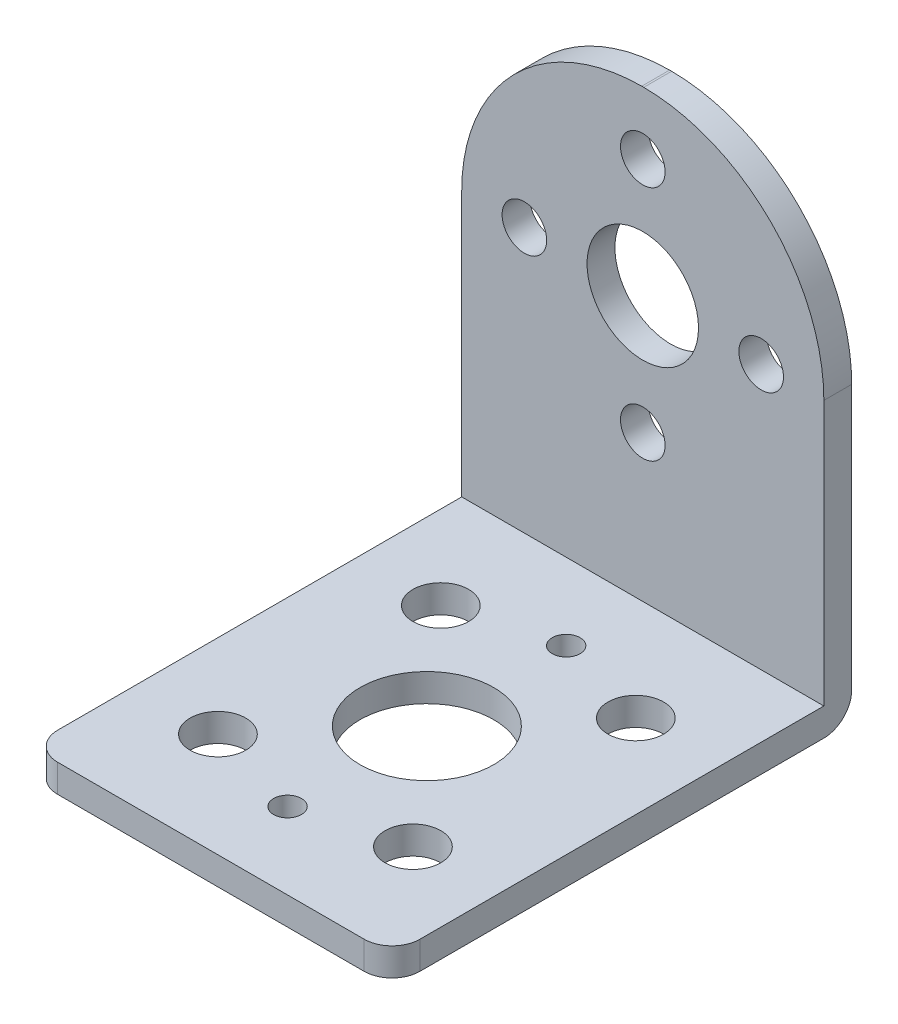
ISO-10303-21;
HEADER;
FILE_DESCRIPTION(('STEP AP214'),'2;1');
FILE_NAME('part.step','',(''),(''),'','','');
FILE_SCHEMA(('AUTOMOTIVE_DESIGN { 1 0 10303 214 1 1 1 1 }'));
ENDSEC;
DATA;
#1=APPLICATION_CONTEXT('core data for automotive mechanical design processes');
#2=APPLICATION_PROTOCOL_DEFINITION('international standard','automotive_design',2000,#1);
#3=PRODUCT_CONTEXT('',#1,'mechanical');
#4=PRODUCT('Part','Part','',(#3));
#5=PRODUCT_RELATED_PRODUCT_CATEGORY('part','',(#4));
#6=PRODUCT_DEFINITION_FORMATION('','',#4);
#7=PRODUCT_DEFINITION_CONTEXT('part definition',#1,'design');
#8=PRODUCT_DEFINITION('design','',#6,#7);
#9=PRODUCT_DEFINITION_SHAPE('','',#8);
#10=(LENGTH_UNIT() NAMED_UNIT(*) SI_UNIT(.MILLI.,.METRE.));
#11=(NAMED_UNIT(*) PLANE_ANGLE_UNIT() SI_UNIT($,.RADIAN.));
#12=(NAMED_UNIT(*) SI_UNIT($,.STERADIAN.) SOLID_ANGLE_UNIT());
#13=UNCERTAINTY_MEASURE_WITH_UNIT(LENGTH_MEASURE(1.E-05),#10,'distance_accuracy_value','');
#14=(GEOMETRIC_REPRESENTATION_CONTEXT(3) GLOBAL_UNCERTAINTY_ASSIGNED_CONTEXT((#13)) GLOBAL_UNIT_ASSIGNED_CONTEXT((#10,
#11,#12)) REPRESENTATION_CONTEXT('',''));
#15=CARTESIAN_POINT('',(0.,0.,0.));
#16=DIRECTION('',(0.,0.,1.));
#17=DIRECTION('',(1.,0.,0.));
#18=AXIS2_PLACEMENT_3D('',#15,#16,#17);
#19=CARTESIAN_POINT('',(13.,2.,0.));
#20=DIRECTION('',(-1.,0.,0.));
#21=DIRECTION('',(0.,0.,1.));
#22=AXIS2_PLACEMENT_3D('',#19,#20,#21);
#23=PLANE('',#22);
#24=DIRECTION('',(0.,0.,-1.));
#25=VECTOR('',#24,1.);
#26=CARTESIAN_POINT('',(13.,2.,0.));
#27=LINE('',#26,#25);
#28=CARTESIAN_POINT('',(13.,2.,13.5));
#29=VERTEX_POINT('',#28);
#30=CARTESIAN_POINT('',(13.,2.,-15.5));
#31=VERTEX_POINT('',#30);
#32=EDGE_CURVE('E243',#29,#31,#27,.T.);
#33=ORIENTED_EDGE('',*,*,#32,.F.);
#34=DIRECTION('',(0.,-1.,0.));
#35=VECTOR('',#34,1.);
#36=CARTESIAN_POINT('',(13.,2.,13.5));
#37=LINE('',#36,#35);
#38=CARTESIAN_POINT('',(13.,0.,13.5));
#39=VERTEX_POINT('',#38);
#40=EDGE_CURVE('E11',#29,#39,#37,.T.);
#41=ORIENTED_EDGE('',*,*,#40,.T.);
#42=DIRECTION('',(0.,0.,-1.));
#43=VECTOR('',#42,1.);
#44=CARTESIAN_POINT('',(13.,0.,0.));
#45=LINE('',#44,#43);
#46=CARTESIAN_POINT('',(13.,0.,-15.5));
#47=VERTEX_POINT('',#46);
#48=EDGE_CURVE('E274',#39,#47,#45,.T.);
#49=ORIENTED_EDGE('',*,*,#48,.T.);
#50=CARTESIAN_POINT('',(13.,2.,-15.5));
#51=DIRECTION('',(-1.,0.,0.));
#52=DIRECTION('',(0.,0.,1.));
#53=AXIS2_PLACEMENT_3D('',#50,#51,#52);
#54=CIRCLE('',#53,2.);
#55=CARTESIAN_POINT('',(13.,2.,-17.5));
#56=VERTEX_POINT('',#55);
#57=EDGE_CURVE('E288',#47,#56,#54,.F.);
#58=ORIENTED_EDGE('',*,*,#57,.T.);
#59=DIRECTION('',(0.,-1.,0.));
#60=VECTOR('',#59,1.);
#61=CARTESIAN_POINT('',(13.,34.,-17.5));
#62=LINE('',#61,#60);
#63=CARTESIAN_POINT('',(13.,21.,-17.5));
#64=VERTEX_POINT('',#63);
#65=EDGE_CURVE('E215',#64,#56,#62,.T.);
#66=ORIENTED_EDGE('',*,*,#65,.F.);
#67=DIRECTION('',(0.,0.,1.));
#68=VECTOR('',#67,1.);
#69=CARTESIAN_POINT('',(13.,21.,-49.5));
#70=LINE('',#69,#68);
#71=CARTESIAN_POINT('',(13.,21.,-15.5));
#72=VERTEX_POINT('',#71);
#73=EDGE_CURVE('E151',#64,#72,#70,.T.);
#74=ORIENTED_EDGE('',*,*,#73,.T.);
#75=DIRECTION('',(0.,-1.,0.));
#76=VECTOR('',#75,1.);
#77=CARTESIAN_POINT('',(13.,34.,-15.5));
#78=LINE('',#77,#76);
#79=EDGE_CURVE('E168',#72,#31,#78,.T.);
#80=ORIENTED_EDGE('',*,*,#79,.T.);
#81=EDGE_LOOP('',(#33,#41,#49,#58,#66,#74,#80));
#82=FACE_BOUND('',#81,.T.);
#83=ADVANCED_FACE('F44',(#82),#23,.F.);
#84=CARTESIAN_POINT('',(13.,34.,-17.5));
#85=DIRECTION('',(0.,0.,1.));
#86=DIRECTION('',(1.,0.,0.));
#87=AXIS2_PLACEMENT_3D('',#84,#85,#86);
#88=PLANE('',#87);
#89=CARTESIAN_POINT('',(8.49999999999999,21.,-17.5));
#90=DIRECTION('',(0.,0.,1.));
#91=DIRECTION('',(1.,0.,0.));
#92=AXIS2_PLACEMENT_3D('',#89,#90,#91);
#93=CIRCLE('',#92,1.6);
#94=CARTESIAN_POINT('',(10.1,21.,-17.5));
#95=VERTEX_POINT('',#94);
#96=EDGE_CURVE('E198',#95,#95,#93,.T.);
#97=ORIENTED_EDGE('',*,*,#96,.T.);
#98=EDGE_LOOP('',(#97));
#99=FACE_BOUND('',#98,.T.);
#100=CARTESIAN_POINT('',(-8.5,21.,-17.5));
#101=DIRECTION('',(0.,0.,1.));
#102=DIRECTION('',(1.,0.,0.));
#103=AXIS2_PLACEMENT_3D('',#100,#101,#102);
#104=CIRCLE('',#103,1.6);
#105=CARTESIAN_POINT('',(-6.9,21.,-17.5));
#106=VERTEX_POINT('',#105);
#107=EDGE_CURVE('E191',#106,#106,#104,.T.);
#108=ORIENTED_EDGE('',*,*,#107,.T.);
#109=EDGE_LOOP('',(#108));
#110=FACE_BOUND('',#109,.T.);
#111=CARTESIAN_POINT('',(0.,21.,-17.5));
#112=DIRECTION('',(0.,0.,1.));
#113=DIRECTION('',(1.,0.,0.));
#114=AXIS2_PLACEMENT_3D('',#111,#112,#113);
#115=CIRCLE('',#114,4.);
#116=CARTESIAN_POINT('',(4.,21.,-17.5));
#117=VERTEX_POINT('',#116);
#118=EDGE_CURVE('E188',#117,#117,#115,.T.);
#119=ORIENTED_EDGE('',*,*,#118,.T.);
#120=EDGE_LOOP('',(#119));
#121=FACE_BOUND('',#120,.T.);
#122=CARTESIAN_POINT('',(0.,29.5,-17.5));
#123=DIRECTION('',(0.,0.,1.));
#124=DIRECTION('',(1.,0.,0.));
#125=AXIS2_PLACEMENT_3D('',#122,#123,#124);
#126=CIRCLE('',#125,1.6);
#127=CARTESIAN_POINT('',(1.6,29.5,-17.5));
#128=VERTEX_POINT('',#127);
#129=EDGE_CURVE('E194',#128,#128,#126,.T.);
#130=ORIENTED_EDGE('',*,*,#129,.T.);
#131=EDGE_LOOP('',(#130));
#132=FACE_BOUND('',#131,.T.);
#133=ORIENTED_EDGE('',*,*,#65,.T.);
#134=DIRECTION('',(-1.,0.,0.));
#135=VECTOR('',#134,1.);
#136=CARTESIAN_POINT('',(13.,2.,-17.5));
#137=LINE('',#136,#135);
#138=CARTESIAN_POINT('',(-13.,2.,-17.5));
#139=VERTEX_POINT('',#138);
#140=EDGE_CURVE('E280',#56,#139,#137,.T.);
#141=ORIENTED_EDGE('',*,*,#140,.T.);
#142=DIRECTION('',(0.,-1.,0.));
#143=VECTOR('',#142,1.);
#144=CARTESIAN_POINT('',(-13.,34.,-17.5));
#145=LINE('',#144,#143);
#146=CARTESIAN_POINT('',(-13.,21.0000000000007,-17.5));
#147=VERTEX_POINT('',#146);
#148=EDGE_CURVE('E212',#147,#139,#145,.T.);
#149=ORIENTED_EDGE('',*,*,#148,.F.);
#150=CARTESIAN_POINT('',(0.,21.,-17.5));
#151=DIRECTION('',(0.,0.,1.));
#152=DIRECTION('',(1.,0.,0.));
#153=AXIS2_PLACEMENT_3D('',#150,#151,#152);
#154=CIRCLE('',#153,13.);
#155=CARTESIAN_POINT('',(-0.0721104708132433,33.9998000015384,-17.5));
#156=VERTEX_POINT('',#155);
#157=EDGE_CURVE('E185',#147,#156,#154,.F.);
#158=ORIENTED_EDGE('',*,*,#157,.T.);
#159=CARTESIAN_POINT('',(-0.0721110255091726,33.9999,-17.5));
#160=DIRECTION('',(0.,0.,1.));
#161=DIRECTION('',(1.,0.,0.));
#162=AXIS2_PLACEMENT_3D('',#159,#160,#161);
#163=CIRCLE('',#162,0.000100000000002766);
#164=CARTESIAN_POINT('',(-0.0721110255091726,34.,-17.5));
#165=VERTEX_POINT('',#164);
#166=EDGE_CURVE('E179',#156,#165,#163,.T.);
#167=ORIENTED_EDGE('',*,*,#166,.T.);
#168=DIRECTION('',(-1.,0.,0.));
#169=VECTOR('',#168,1.);
#170=CARTESIAN_POINT('',(13.,34.,-17.5));
#171=LINE('',#170,#169);
#172=CARTESIAN_POINT('',(0.0721110255093565,34.,-17.5));
#173=VERTEX_POINT('',#172);
#174=EDGE_CURVE('E204',#173,#165,#171,.T.);
#175=ORIENTED_EDGE('',*,*,#174,.F.);
#176=CARTESIAN_POINT('',(0.0721110255093571,33.9999,-17.5));
#177=DIRECTION('',(0.,0.,1.));
#178=DIRECTION('',(1.,0.,0.));
#179=AXIS2_PLACEMENT_3D('',#176,#177,#178);
#180=CIRCLE('',#179,9.99999999923578E-05);
#181=CARTESIAN_POINT('',(0.0721104708134278,33.9998000015385,-17.5));
#182=VERTEX_POINT('',#181);
#183=EDGE_CURVE('E183',#173,#182,#180,.T.);
#184=ORIENTED_EDGE('',*,*,#183,.T.);
#185=CARTESIAN_POINT('',(0.,21.,-17.5));
#186=DIRECTION('',(0.,0.,1.));
#187=DIRECTION('',(1.,0.,0.));
#188=AXIS2_PLACEMENT_3D('',#185,#186,#187);
#189=CIRCLE('',#188,13.);
#190=EDGE_CURVE('E148',#182,#64,#189,.F.);
#191=ORIENTED_EDGE('',*,*,#190,.T.);
#192=EDGE_LOOP('',(#133,#141,#149,#158,#167,#175,#184,#191));
#193=FACE_BOUND('',#192,.T.);
#194=CARTESIAN_POINT('',(0.,12.5,-17.5));
#195=DIRECTION('',(0.,0.,1.));
#196=DIRECTION('',(1.,0.,0.));
#197=AXIS2_PLACEMENT_3D('',#194,#195,#196);
#198=CIRCLE('',#197,1.6);
#199=CARTESIAN_POINT('',(1.6,12.5,-17.5));
#200=VERTEX_POINT('',#199);
#201=EDGE_CURVE('E201',#200,#200,#198,.T.);
#202=ORIENTED_EDGE('',*,*,#201,.T.);
#203=EDGE_LOOP('',(#202));
#204=FACE_BOUND('',#203,.T.);
#205=ADVANCED_FACE('F322',(#99,#110,#121,#132,#193,#204),#88,.F.);
#206=CARTESIAN_POINT('',(-13.,34.,-15.5));
#207=DIRECTION('',(0.,0.,-1.));
#208=DIRECTION('',(-1.,0.,0.));
#209=AXIS2_PLACEMENT_3D('',#206,#207,#208);
#210=PLANE('',#209);
#211=CARTESIAN_POINT('',(8.49999999999999,21.,-15.5));
#212=DIRECTION('',(0.,0.,1.));
#213=DIRECTION('',(1.,0.,0.));
#214=AXIS2_PLACEMENT_3D('',#211,#212,#213);
#215=CIRCLE('',#214,1.6);
#216=CARTESIAN_POINT('',(10.1,21.,-15.5));
#217=VERTEX_POINT('',#216);
#218=EDGE_CURVE('E626',#217,#217,#215,.T.);
#219=ORIENTED_EDGE('',*,*,#218,.F.);
#220=EDGE_LOOP('',(#219));
#221=FACE_BOUND('',#220,.T.);
#222=CARTESIAN_POINT('',(-8.5,21.,-15.5));
#223=DIRECTION('',(0.,0.,1.));
#224=DIRECTION('',(1.,0.,0.));
#225=AXIS2_PLACEMENT_3D('',#222,#223,#224);
#226=CIRCLE('',#225,1.6);
#227=CARTESIAN_POINT('',(-6.9,21.,-15.5));
#228=VERTEX_POINT('',#227);
#229=EDGE_CURVE('E620',#228,#228,#226,.T.);
#230=ORIENTED_EDGE('',*,*,#229,.F.);
#231=EDGE_LOOP('',(#230));
#232=FACE_BOUND('',#231,.T.);
#233=CARTESIAN_POINT('',(0.,21.,-15.5));
#234=DIRECTION('',(0.,0.,1.));
#235=DIRECTION('',(1.,0.,0.));
#236=AXIS2_PLACEMENT_3D('',#233,#234,#235);
#237=CIRCLE('',#236,4.);
#238=CARTESIAN_POINT('',(4.,21.,-15.5));
#239=VERTEX_POINT('',#238);
#240=EDGE_CURVE('E613',#239,#239,#237,.T.);
#241=ORIENTED_EDGE('',*,*,#240,.F.);
#242=EDGE_LOOP('',(#241));
#243=FACE_BOUND('',#242,.T.);
#244=CARTESIAN_POINT('',(0.,29.5,-15.5));
#245=DIRECTION('',(0.,0.,1.));
#246=DIRECTION('',(1.,0.,0.));
#247=AXIS2_PLACEMENT_3D('',#244,#245,#246);
#248=CIRCLE('',#247,1.6);
#249=CARTESIAN_POINT('',(1.6,29.5,-15.5));
#250=VERTEX_POINT('',#249);
#251=EDGE_CURVE('E152',#250,#250,#248,.T.);
#252=ORIENTED_EDGE('',*,*,#251,.F.);
#253=EDGE_LOOP('',(#252));
#254=FACE_BOUND('',#253,.T.);
#255=ORIENTED_EDGE('',*,*,#79,.F.);
#256=CARTESIAN_POINT('',(0.,21.,-15.5));
#257=DIRECTION('',(0.,0.,-1.));
#258=DIRECTION('',(1.,0.,0.));
#259=AXIS2_PLACEMENT_3D('',#256,#257,#258);
#260=CIRCLE('',#259,13.);
#261=CARTESIAN_POINT('',(0.0721104708134278,33.9998000015385,-15.5));
#262=VERTEX_POINT('',#261);
#263=EDGE_CURVE('E145',#262,#72,#260,.T.);
#264=ORIENTED_EDGE('',*,*,#263,.F.);
#265=CARTESIAN_POINT('',(0.0721110255093571,33.9999,-15.5));
#266=DIRECTION('',(0.,0.,1.));
#267=DIRECTION('',(1.,0.,0.));
#268=AXIS2_PLACEMENT_3D('',#265,#266,#267);
#269=CIRCLE('',#268,9.99999999923578E-05);
#270=CARTESIAN_POINT('',(0.0721110255093571,34.,-15.5));
#271=VERTEX_POINT('',#270);
#272=EDGE_CURVE('E155',#271,#262,#269,.T.);
#273=ORIENTED_EDGE('',*,*,#272,.F.);
#274=DIRECTION('',(1.,0.,0.));
#275=VECTOR('',#274,1.);
#276=CARTESIAN_POINT('',(-13.,34.,-15.5));
#277=LINE('',#276,#275);
#278=CARTESIAN_POINT('',(-0.0721110255091726,34.,-15.5));
#279=VERTEX_POINT('',#278);
#280=EDGE_CURVE('E207',#279,#271,#277,.T.);
#281=ORIENTED_EDGE('',*,*,#280,.F.);
#282=CARTESIAN_POINT('',(-0.0721110255091726,33.9999,-15.5));
#283=DIRECTION('',(0.,0.,1.));
#284=DIRECTION('',(-1.,0.,0.));
#285=AXIS2_PLACEMENT_3D('',#282,#283,#284);
#286=CIRCLE('',#285,0.000100000000002766);
#287=CARTESIAN_POINT('',(-0.0721104708132433,33.9998000015384,-15.5));
#288=VERTEX_POINT('',#287);
#289=EDGE_CURVE('E172',#288,#279,#286,.T.);
#290=ORIENTED_EDGE('',*,*,#289,.F.);
#291=CARTESIAN_POINT('',(0.,21.,-15.5));
#292=DIRECTION('',(0.,0.,-1.));
#293=DIRECTION('',(1.,0.,0.));
#294=AXIS2_PLACEMENT_3D('',#291,#292,#293);
#295=CIRCLE('',#294,13.);
#296=CARTESIAN_POINT('',(-13.,21.0000000000007,-15.5));
#297=VERTEX_POINT('',#296);
#298=EDGE_CURVE('E169',#297,#288,#295,.T.);
#299=ORIENTED_EDGE('',*,*,#298,.F.);
#300=DIRECTION('',(0.,-1.,0.));
#301=VECTOR('',#300,1.);
#302=CARTESIAN_POINT('',(-13.,34.,-15.5));
#303=LINE('',#302,#301);
#304=CARTESIAN_POINT('',(-13.,2.,-15.5));
#305=VERTEX_POINT('',#304);
#306=EDGE_CURVE('E210',#297,#305,#303,.T.);
#307=ORIENTED_EDGE('',*,*,#306,.T.);
#308=DIRECTION('',(-1.,0.,0.));
#309=VECTOR('',#308,1.);
#310=CARTESIAN_POINT('',(0.,2.,-15.5));
#311=LINE('',#310,#309);
#312=EDGE_CURVE('E245',#31,#305,#311,.T.);
#313=ORIENTED_EDGE('',*,*,#312,.F.);
#314=EDGE_LOOP('',(#255,#264,#273,#281,#290,#299,#307,#313));
#315=FACE_BOUND('',#314,.T.);
#316=CARTESIAN_POINT('',(0.,12.5,-15.5));
#317=DIRECTION('',(0.,0.,1.));
#318=DIRECTION('',(1.,0.,0.));
#319=AXIS2_PLACEMENT_3D('',#316,#317,#318);
#320=CIRCLE('',#319,1.6);
#321=CARTESIAN_POINT('',(1.6,12.5,-15.5));
#322=VERTEX_POINT('',#321);
#323=EDGE_CURVE('E623',#322,#322,#320,.T.);
#324=ORIENTED_EDGE('',*,*,#323,.F.);
#325=EDGE_LOOP('',(#324));
#326=FACE_BOUND('',#325,.T.);
#327=ADVANCED_FACE('F164',(#221,#232,#243,#254,#315,#326),#210,.F.);
#328=CARTESIAN_POINT('',(0.,34.,0.));
#329=DIRECTION('',(0.,1.,0.));
#330=DIRECTION('',(0.,0.,1.));
#331=AXIS2_PLACEMENT_3D('',#328,#329,#330);
#332=PLANE('',#331);
#333=DIRECTION('',(0.,0.,1.));
#334=VECTOR('',#333,1.);
#335=CARTESIAN_POINT('',(0.0721110255093571,34.,-49.5));
#336=LINE('',#335,#334);
#337=EDGE_CURVE('E158',#173,#271,#336,.T.);
#338=ORIENTED_EDGE('',*,*,#337,.F.);
#339=ORIENTED_EDGE('',*,*,#174,.T.);
#340=DIRECTION('',(0.,0.,1.));
#341=VECTOR('',#340,1.);
#342=CARTESIAN_POINT('',(-0.0721110255091726,34.,-49.5));
#343=LINE('',#342,#341);
#344=EDGE_CURVE('E250',#165,#279,#343,.T.);
#345=ORIENTED_EDGE('',*,*,#344,.T.);
#346=ORIENTED_EDGE('',*,*,#280,.T.);
#347=EDGE_LOOP('',(#338,#339,#345,#346));
#348=FACE_BOUND('',#347,.T.);
#349=ADVANCED_FACE('F347',(#348),#332,.T.);
#350=CARTESIAN_POINT('',(0.,2.,15.5));
#351=DIRECTION('',(0.,0.,-1.));
#352=DIRECTION('',(-1.,0.,0.));
#353=AXIS2_PLACEMENT_3D('',#350,#351,#352);
#354=PLANE('',#353);
#355=DIRECTION('',(1.,0.,0.));
#356=VECTOR('',#355,1.);
#357=CARTESIAN_POINT('',(0.,2.,15.5));
#358=LINE('',#357,#356);
#359=CARTESIAN_POINT('',(-11.,2.,15.5));
#360=VERTEX_POINT('',#359);
#361=CARTESIAN_POINT('',(11.,2.,15.5));
#362=VERTEX_POINT('',#361);
#363=EDGE_CURVE('E241',#360,#362,#358,.T.);
#364=ORIENTED_EDGE('',*,*,#363,.F.);
#365=DIRECTION('',(0.,-1.,0.));
#366=VECTOR('',#365,1.);
#367=CARTESIAN_POINT('',(-11.,2.,15.5));
#368=LINE('',#367,#366);
#369=CARTESIAN_POINT('',(-11.,0.,15.5));
#370=VERTEX_POINT('',#369);
#371=EDGE_CURVE('E292',#360,#370,#368,.T.);
#372=ORIENTED_EDGE('',*,*,#371,.T.);
#373=DIRECTION('',(1.,0.,0.));
#374=VECTOR('',#373,1.);
#375=CARTESIAN_POINT('',(0.,0.,15.5));
#376=LINE('',#375,#374);
#377=CARTESIAN_POINT('',(11.,0.,15.5));
#378=VERTEX_POINT('',#377);
#379=EDGE_CURVE('E271',#370,#378,#376,.T.);
#380=ORIENTED_EDGE('',*,*,#379,.T.);
#381=DIRECTION('',(0.,-1.,0.));
#382=VECTOR('',#381,1.);
#383=CARTESIAN_POINT('',(11.,2.,15.5));
#384=LINE('',#383,#382);
#385=EDGE_CURVE('E290',#378,#362,#384,.F.);
#386=ORIENTED_EDGE('',*,*,#385,.T.);
#387=EDGE_LOOP('',(#364,#372,#380,#386));
#388=FACE_BOUND('',#387,.T.);
#389=ADVANCED_FACE('F306',(#388),#354,.F.);
#390=CARTESIAN_POINT('',(0.,2.,-10.));
#391=DIRECTION('',(0.,-1.,0.));
#392=DIRECTION('',(0.,0.,-1.));
#393=AXIS2_PLACEMENT_3D('',#390,#391,#392);
#394=CYLINDRICAL_SURFACE('',#393,1.);
#395=CARTESIAN_POINT('',(0.,2.,-10.));
#396=DIRECTION('',(0.,1.,0.));
#397=DIRECTION('',(0.,0.,1.));
#398=AXIS2_PLACEMENT_3D('',#395,#396,#397);
#399=CIRCLE('',#398,1.);
#400=CARTESIAN_POINT('',(0.,2.,-9.));
#401=VERTEX_POINT('',#400);
#402=EDGE_CURVE('E238',#401,#401,#399,.T.);
#403=ORIENTED_EDGE('',*,*,#402,.T.);
#404=EDGE_LOOP('',(#403));
#405=FACE_BOUND('',#404,.T.);
#406=CARTESIAN_POINT('',(0.,0.,-10.));
#407=DIRECTION('',(0.,1.,0.));
#408=DIRECTION('',(0.,0.,1.));
#409=AXIS2_PLACEMENT_3D('',#406,#407,#408);
#410=CIRCLE('',#409,1.);
#411=CARTESIAN_POINT('',(0.,0.,-9.));
#412=VERTEX_POINT('',#411);
#413=EDGE_CURVE('E268',#412,#412,#410,.T.);
#414=ORIENTED_EDGE('',*,*,#413,.F.);
#415=EDGE_LOOP('',(#414));
#416=FACE_BOUND('',#415,.T.);
#417=ADVANCED_FACE('F346',(#405,#416),#394,.F.);
#418=CARTESIAN_POINT('',(0.,2.,10.));
#419=DIRECTION('',(0.,-1.,0.));
#420=DIRECTION('',(0.,0.,-1.));
#421=AXIS2_PLACEMENT_3D('',#418,#419,#420);
#422=CYLINDRICAL_SURFACE('',#421,1.);
#423=CARTESIAN_POINT('',(0.,2.,10.));
#424=DIRECTION('',(0.,1.,0.));
#425=DIRECTION('',(0.,0.,1.));
#426=AXIS2_PLACEMENT_3D('',#423,#424,#425);
#427=CIRCLE('',#426,1.);
#428=CARTESIAN_POINT('',(0.,2.,11.));
#429=VERTEX_POINT('',#428);
#430=EDGE_CURVE('E235',#429,#429,#427,.T.);
#431=ORIENTED_EDGE('',*,*,#430,.T.);
#432=EDGE_LOOP('',(#431));
#433=FACE_BOUND('',#432,.T.);
#434=CARTESIAN_POINT('',(0.,0.,10.));
#435=DIRECTION('',(0.,1.,0.));
#436=DIRECTION('',(0.,0.,1.));
#437=AXIS2_PLACEMENT_3D('',#434,#435,#436);
#438=CIRCLE('',#437,1.);
#439=CARTESIAN_POINT('',(0.,0.,11.));
#440=VERTEX_POINT('',#439);
#441=EDGE_CURVE('E265',#440,#440,#438,.T.);
#442=ORIENTED_EDGE('',*,*,#441,.F.);
#443=EDGE_LOOP('',(#442));
#444=FACE_BOUND('',#443,.T.);
#445=ADVANCED_FACE('F350',(#433,#444),#422,.F.);
#446=CARTESIAN_POINT('',(7.,2.,8.));
#447=DIRECTION('',(0.,-1.,0.));
#448=DIRECTION('',(0.,0.,-1.));
#449=AXIS2_PLACEMENT_3D('',#446,#447,#448);
#450=CYLINDRICAL_SURFACE('',#449,2.);
#451=CARTESIAN_POINT('',(7.,2.,8.));
#452=DIRECTION('',(0.,1.,0.));
#453=DIRECTION('',(0.,0.,1.));
#454=AXIS2_PLACEMENT_3D('',#451,#452,#453);
#455=CIRCLE('',#454,2.);
#456=CARTESIAN_POINT('',(7.,2.,10.));
#457=VERTEX_POINT('',#456);
#458=EDGE_CURVE('E232',#457,#457,#455,.T.);
#459=ORIENTED_EDGE('',*,*,#458,.T.);
#460=EDGE_LOOP('',(#459));
#461=FACE_BOUND('',#460,.T.);
#462=CARTESIAN_POINT('',(7.,0.,8.));
#463=DIRECTION('',(0.,1.,0.));
#464=DIRECTION('',(0.,0.,1.));
#465=AXIS2_PLACEMENT_3D('',#462,#463,#464);
#466=CIRCLE('',#465,2.);
#467=CARTESIAN_POINT('',(7.,0.,10.));
#468=VERTEX_POINT('',#467);
#469=EDGE_CURVE('E262',#468,#468,#466,.T.);
#470=ORIENTED_EDGE('',*,*,#469,.F.);
#471=EDGE_LOOP('',(#470));
#472=FACE_BOUND('',#471,.T.);
#473=ADVANCED_FACE('F354',(#461,#472),#450,.F.);
#474=CARTESIAN_POINT('',(7.,2.,-8.));
#475=DIRECTION('',(0.,-1.,0.));
#476=DIRECTION('',(0.,0.,-1.));
#477=AXIS2_PLACEMENT_3D('',#474,#475,#476);
#478=CYLINDRICAL_SURFACE('',#477,2.);
#479=CARTESIAN_POINT('',(7.,2.,-8.));
#480=DIRECTION('',(0.,1.,0.));
#481=DIRECTION('',(0.,0.,1.));
#482=AXIS2_PLACEMENT_3D('',#479,#480,#481);
#483=CIRCLE('',#482,2.);
#484=CARTESIAN_POINT('',(7.,2.,-6.));
#485=VERTEX_POINT('',#484);
#486=EDGE_CURVE('E229',#485,#485,#483,.T.);
#487=ORIENTED_EDGE('',*,*,#486,.T.);
#488=EDGE_LOOP('',(#487));
#489=FACE_BOUND('',#488,.T.);
#490=CARTESIAN_POINT('',(7.,0.,-8.));
#491=DIRECTION('',(0.,1.,0.));
#492=DIRECTION('',(0.,0.,1.));
#493=AXIS2_PLACEMENT_3D('',#490,#491,#492);
#494=CIRCLE('',#493,2.);
#495=CARTESIAN_POINT('',(7.,0.,-6.));
#496=VERTEX_POINT('',#495);
#497=EDGE_CURVE('E259',#496,#496,#494,.T.);
#498=ORIENTED_EDGE('',*,*,#497,.F.);
#499=EDGE_LOOP('',(#498));
#500=FACE_BOUND('',#499,.T.);
#501=ADVANCED_FACE('F358',(#489,#500),#478,.F.);
#502=CARTESIAN_POINT('',(-7.,2.,-8.));
#503=DIRECTION('',(0.,-1.,0.));
#504=DIRECTION('',(0.,0.,-1.));
#505=AXIS2_PLACEMENT_3D('',#502,#503,#504);
#506=CYLINDRICAL_SURFACE('',#505,2.);
#507=CARTESIAN_POINT('',(-7.,2.,-8.));
#508=DIRECTION('',(0.,1.,0.));
#509=DIRECTION('',(0.,0.,1.));
#510=AXIS2_PLACEMENT_3D('',#507,#508,#509);
#511=CIRCLE('',#510,2.);
#512=CARTESIAN_POINT('',(-7.,2.,-6.));
#513=VERTEX_POINT('',#512);
#514=EDGE_CURVE('E226',#513,#513,#511,.T.);
#515=ORIENTED_EDGE('',*,*,#514,.T.);
#516=EDGE_LOOP('',(#515));
#517=FACE_BOUND('',#516,.T.);
#518=CARTESIAN_POINT('',(-7.,0.,-8.));
#519=DIRECTION('',(0.,1.,0.));
#520=DIRECTION('',(0.,0.,1.));
#521=AXIS2_PLACEMENT_3D('',#518,#519,#520);
#522=CIRCLE('',#521,2.);
#523=CARTESIAN_POINT('',(-7.,0.,-6.));
#524=VERTEX_POINT('',#523);
#525=EDGE_CURVE('E256',#524,#524,#522,.T.);
#526=ORIENTED_EDGE('',*,*,#525,.F.);
#527=EDGE_LOOP('',(#526));
#528=FACE_BOUND('',#527,.T.);
#529=ADVANCED_FACE('F362',(#517,#528),#506,.F.);
#530=CARTESIAN_POINT('',(-7.,2.,8.));
#531=DIRECTION('',(0.,-1.,0.));
#532=DIRECTION('',(0.,0.,-1.));
#533=AXIS2_PLACEMENT_3D('',#530,#531,#532);
#534=CYLINDRICAL_SURFACE('',#533,2.);
#535=CARTESIAN_POINT('',(-7.,2.,8.));
#536=DIRECTION('',(0.,1.,0.));
#537=DIRECTION('',(0.,0.,1.));
#538=AXIS2_PLACEMENT_3D('',#535,#536,#537);
#539=CIRCLE('',#538,2.);
#540=CARTESIAN_POINT('',(-7.,2.,10.));
#541=VERTEX_POINT('',#540);
#542=EDGE_CURVE('E222',#541,#541,#539,.T.);
#543=ORIENTED_EDGE('',*,*,#542,.T.);
#544=EDGE_LOOP('',(#543));
#545=FACE_BOUND('',#544,.T.);
#546=CARTESIAN_POINT('',(-7.,0.,8.));
#547=DIRECTION('',(0.,1.,0.));
#548=DIRECTION('',(0.,0.,1.));
#549=AXIS2_PLACEMENT_3D('',#546,#547,#548);
#550=CIRCLE('',#549,2.);
#551=CARTESIAN_POINT('',(-7.,0.,10.));
#552=VERTEX_POINT('',#551);
#553=EDGE_CURVE('E253',#552,#552,#550,.T.);
#554=ORIENTED_EDGE('',*,*,#553,.F.);
#555=EDGE_LOOP('',(#554));
#556=FACE_BOUND('',#555,.T.);
#557=ADVANCED_FACE('F366',(#545,#556),#534,.F.);
#558=CARTESIAN_POINT('',(0.,2.,0.));
#559=DIRECTION('',(0.,-1.,0.));
#560=DIRECTION('',(0.,0.,-1.));
#561=AXIS2_PLACEMENT_3D('',#558,#559,#560);
#562=CYLINDRICAL_SURFACE('',#561,4.8);
#563=CARTESIAN_POINT('',(0.,2.,0.));
#564=DIRECTION('',(0.,1.,0.));
#565=DIRECTION('',(0.,0.,1.));
#566=AXIS2_PLACEMENT_3D('',#563,#564,#565);
#567=CIRCLE('',#566,4.8);
#568=CARTESIAN_POINT('',(0.,2.,4.8));
#569=VERTEX_POINT('',#568);
#570=EDGE_CURVE('E219',#569,#569,#567,.T.);
#571=ORIENTED_EDGE('',*,*,#570,.T.);
#572=EDGE_LOOP('',(#571));
#573=FACE_BOUND('',#572,.T.);
#574=CARTESIAN_POINT('',(0.,0.,0.));
#575=DIRECTION('',(0.,1.,0.));
#576=DIRECTION('',(0.,0.,1.));
#577=AXIS2_PLACEMENT_3D('',#574,#575,#576);
#578=CIRCLE('',#577,4.8);
#579=CARTESIAN_POINT('',(0.,0.,4.8));
#580=VERTEX_POINT('',#579);
#581=EDGE_CURVE('E218',#580,#580,#578,.T.);
#582=ORIENTED_EDGE('',*,*,#581,.F.);
#583=EDGE_LOOP('',(#582));
#584=FACE_BOUND('',#583,.T.);
#585=ADVANCED_FACE('F370',(#573,#584),#562,.F.);
#586=CARTESIAN_POINT('',(-13.,2.,0.));
#587=DIRECTION('',(1.,0.,0.));
#588=DIRECTION('',(0.,0.,-1.));
#589=AXIS2_PLACEMENT_3D('',#586,#587,#588);
#590=PLANE('',#589);
#591=DIRECTION('',(0.,0.,1.));
#592=VECTOR('',#591,1.);
#593=CARTESIAN_POINT('',(-13.,0.,0.));
#594=LINE('',#593,#592);
#595=CARTESIAN_POINT('',(-13.,0.,-15.5));
#596=VERTEX_POINT('',#595);
#597=CARTESIAN_POINT('',(-13.,0.,13.5));
#598=VERTEX_POINT('',#597);
#599=EDGE_CURVE('E223',#596,#598,#594,.T.);
#600=ORIENTED_EDGE('',*,*,#599,.T.);
#601=DIRECTION('',(0.,-1.,0.));
#602=VECTOR('',#601,1.);
#603=CARTESIAN_POINT('',(-13.,2.,13.5));
#604=LINE('',#603,#602);
#605=CARTESIAN_POINT('',(-13.,2.,13.5));
#606=VERTEX_POINT('',#605);
#607=EDGE_CURVE('E67',#598,#606,#604,.F.);
#608=ORIENTED_EDGE('',*,*,#607,.T.);
#609=DIRECTION('',(0.,0.,1.));
#610=VECTOR('',#609,1.);
#611=CARTESIAN_POINT('',(-13.,2.,0.));
#612=LINE('',#611,#610);
#613=EDGE_CURVE('E248',#305,#606,#612,.T.);
#614=ORIENTED_EDGE('',*,*,#613,.F.);
#615=ORIENTED_EDGE('',*,*,#306,.F.);
#616=DIRECTION('',(0.,0.,1.));
#617=VECTOR('',#616,1.);
#618=CARTESIAN_POINT('',(-13.,21.0000000000007,-49.5));
#619=LINE('',#618,#617);
#620=EDGE_CURVE('E176',#147,#297,#619,.T.);
#621=ORIENTED_EDGE('',*,*,#620,.F.);
#622=ORIENTED_EDGE('',*,*,#148,.T.);
#623=CARTESIAN_POINT('',(-13.,2.,-15.5));
#624=DIRECTION('',(1.,0.,0.));
#625=DIRECTION('',(0.,0.,-1.));
#626=AXIS2_PLACEMENT_3D('',#623,#624,#625);
#627=CIRCLE('',#626,2.);
#628=EDGE_CURVE('E283',#139,#596,#627,.F.);
#629=ORIENTED_EDGE('',*,*,#628,.T.);
#630=EDGE_LOOP('',(#600,#608,#614,#615,#621,#622,#629));
#631=FACE_BOUND('',#630,.T.);
#632=ADVANCED_FACE('F314',(#631),#590,.F.);
#633=CARTESIAN_POINT('',(0.,2.,0.));
#634=DIRECTION('',(0.,1.,0.));
#635=DIRECTION('',(0.,0.,1.));
#636=AXIS2_PLACEMENT_3D('',#633,#634,#635);
#637=PLANE('',#636);
#638=ORIENTED_EDGE('',*,*,#570,.F.);
#639=EDGE_LOOP('',(#638));
#640=FACE_BOUND('',#639,.T.);
#641=ORIENTED_EDGE('',*,*,#542,.F.);
#642=EDGE_LOOP('',(#641));
#643=FACE_BOUND('',#642,.T.);
#644=ORIENTED_EDGE('',*,*,#514,.F.);
#645=EDGE_LOOP('',(#644));
#646=FACE_BOUND('',#645,.T.);
#647=ORIENTED_EDGE('',*,*,#486,.F.);
#648=EDGE_LOOP('',(#647));
#649=FACE_BOUND('',#648,.T.);
#650=ORIENTED_EDGE('',*,*,#458,.F.);
#651=EDGE_LOOP('',(#650));
#652=FACE_BOUND('',#651,.T.);
#653=ORIENTED_EDGE('',*,*,#430,.F.);
#654=EDGE_LOOP('',(#653));
#655=FACE_BOUND('',#654,.T.);
#656=ORIENTED_EDGE('',*,*,#402,.F.);
#657=EDGE_LOOP('',(#656));
#658=FACE_BOUND('',#657,.T.);
#659=ORIENTED_EDGE('',*,*,#613,.T.);
#660=CARTESIAN_POINT('',(-11.,2.,13.5));
#661=DIRECTION('',(0.,1.,0.));
#662=DIRECTION('',(0.,0.,1.));
#663=AXIS2_PLACEMENT_3D('',#660,#661,#662);
#664=CIRCLE('',#663,2.);
#665=EDGE_CURVE('E52',#606,#360,#664,.T.);
#666=ORIENTED_EDGE('',*,*,#665,.T.);
#667=ORIENTED_EDGE('',*,*,#363,.T.);
#668=CARTESIAN_POINT('',(11.,2.,13.5));
#669=DIRECTION('',(0.,1.,0.));
#670=DIRECTION('',(0.,0.,1.));
#671=AXIS2_PLACEMENT_3D('',#668,#669,#670);
#672=CIRCLE('',#671,2.);
#673=EDGE_CURVE('E59',#362,#29,#672,.T.);
#674=ORIENTED_EDGE('',*,*,#673,.T.);
#675=ORIENTED_EDGE('',*,*,#32,.T.);
#676=ORIENTED_EDGE('',*,*,#312,.T.);
#677=EDGE_LOOP('',(#659,#666,#667,#674,#675,#676));
#678=FACE_BOUND('',#677,.T.);
#679=ADVANCED_FACE('F302',(#640,#643,#646,#649,#652,#655,#658,#678),#637,.T.);
#680=CARTESIAN_POINT('',(0.,0.,0.));
#681=DIRECTION('',(0.,1.,0.));
#682=DIRECTION('',(0.,0.,1.));
#683=AXIS2_PLACEMENT_3D('',#680,#681,#682);
#684=PLANE('',#683);
#685=ORIENTED_EDGE('',*,*,#581,.T.);
#686=EDGE_LOOP('',(#685));
#687=FACE_BOUND('',#686,.T.);
#688=ORIENTED_EDGE('',*,*,#553,.T.);
#689=EDGE_LOOP('',(#688));
#690=FACE_BOUND('',#689,.T.);
#691=ORIENTED_EDGE('',*,*,#525,.T.);
#692=EDGE_LOOP('',(#691));
#693=FACE_BOUND('',#692,.T.);
#694=ORIENTED_EDGE('',*,*,#497,.T.);
#695=EDGE_LOOP('',(#694));
#696=FACE_BOUND('',#695,.T.);
#697=ORIENTED_EDGE('',*,*,#469,.T.);
#698=EDGE_LOOP('',(#697));
#699=FACE_BOUND('',#698,.T.);
#700=ORIENTED_EDGE('',*,*,#441,.T.);
#701=EDGE_LOOP('',(#700));
#702=FACE_BOUND('',#701,.T.);
#703=ORIENTED_EDGE('',*,*,#413,.T.);
#704=EDGE_LOOP('',(#703));
#705=FACE_BOUND('',#704,.T.);
#706=ORIENTED_EDGE('',*,*,#379,.F.);
#707=CARTESIAN_POINT('',(-11.,0.,13.5));
#708=DIRECTION('',(0.,1.,0.));
#709=DIRECTION('',(0.,0.,1.));
#710=AXIS2_PLACEMENT_3D('',#707,#708,#709);
#711=CIRCLE('',#710,2.);
#712=EDGE_CURVE('E297',#370,#598,#711,.F.);
#713=ORIENTED_EDGE('',*,*,#712,.T.);
#714=ORIENTED_EDGE('',*,*,#599,.F.);
#715=DIRECTION('',(-1.,0.,0.));
#716=VECTOR('',#715,1.);
#717=CARTESIAN_POINT('',(0.,0.,-15.5));
#718=LINE('',#717,#716);
#719=EDGE_CURVE('E285',#596,#47,#718,.F.);
#720=ORIENTED_EDGE('',*,*,#719,.T.);
#721=ORIENTED_EDGE('',*,*,#48,.F.);
#722=CARTESIAN_POINT('',(11.,0.,13.5));
#723=DIRECTION('',(0.,1.,0.));
#724=DIRECTION('',(0.,0.,1.));
#725=AXIS2_PLACEMENT_3D('',#722,#723,#724);
#726=CIRCLE('',#725,2.);
#727=EDGE_CURVE('E295',#39,#378,#726,.F.);
#728=ORIENTED_EDGE('',*,*,#727,.T.);
#729=EDGE_LOOP('',(#706,#713,#714,#720,#721,#728));
#730=FACE_BOUND('',#729,.T.);
#731=ADVANCED_FACE('F312',(#687,#690,#693,#696,#699,#702,#705,#730),#684,.F.);
#732=CARTESIAN_POINT('',(0.,21.,-49.5));
#733=DIRECTION('',(0.,0.,1.));
#734=DIRECTION('',(1.,0.,0.));
#735=AXIS2_PLACEMENT_3D('',#732,#733,#734);
#736=CYLINDRICAL_SURFACE('',#735,13.);
#737=ORIENTED_EDGE('',*,*,#620,.T.);
#738=ORIENTED_EDGE('',*,*,#298,.T.);
#739=DIRECTION('',(0.,0.,1.));
#740=VECTOR('',#739,1.);
#741=CARTESIAN_POINT('',(-0.0721104708132433,33.9998000015384,-49.5));
#742=LINE('',#741,#740);
#743=EDGE_CURVE('E177',#156,#288,#742,.T.);
#744=ORIENTED_EDGE('',*,*,#743,.F.);
#745=ORIENTED_EDGE('',*,*,#157,.F.);
#746=EDGE_LOOP('',(#737,#738,#744,#745));
#747=FACE_BOUND('',#746,.T.);
#748=ADVANCED_FACE('F404',(#747),#736,.T.);
#749=CARTESIAN_POINT('',(-0.0721110255091726,33.9999,-49.5));
#750=DIRECTION('',(0.,0.,1.));
#751=DIRECTION('',(1.,0.,0.));
#752=AXIS2_PLACEMENT_3D('',#749,#750,#751);
#753=CYLINDRICAL_SURFACE('',#752,0.000100000000002766);
#754=ORIENTED_EDGE('',*,*,#743,.T.);
#755=ORIENTED_EDGE('',*,*,#289,.T.);
#756=ORIENTED_EDGE('',*,*,#344,.F.);
#757=ORIENTED_EDGE('',*,*,#166,.F.);
#758=EDGE_LOOP('',(#754,#755,#756,#757));
#759=FACE_BOUND('',#758,.T.);
#760=ADVANCED_FACE('F398',(#759),#753,.F.);
#761=CARTESIAN_POINT('',(0.,21.,-49.5));
#762=DIRECTION('',(0.,0.,1.));
#763=DIRECTION('',(1.,0.,0.));
#764=AXIS2_PLACEMENT_3D('',#761,#762,#763);
#765=CYLINDRICAL_SURFACE('',#764,13.);
#766=DIRECTION('',(0.,0.,1.));
#767=VECTOR('',#766,1.);
#768=CARTESIAN_POINT('',(0.0721104708134278,33.9998000015385,-49.5));
#769=LINE('',#768,#767);
#770=EDGE_CURVE('E141',#182,#262,#769,.T.);
#771=ORIENTED_EDGE('',*,*,#770,.T.);
#772=ORIENTED_EDGE('',*,*,#263,.T.);
#773=ORIENTED_EDGE('',*,*,#73,.F.);
#774=ORIENTED_EDGE('',*,*,#190,.F.);
#775=EDGE_LOOP('',(#771,#772,#773,#774));
#776=FACE_BOUND('',#775,.T.);
#777=ADVANCED_FACE('F143',(#776),#765,.T.);
#778=CARTESIAN_POINT('',(0.0721110255093571,33.9999,-49.5));
#779=DIRECTION('',(0.,0.,1.));
#780=DIRECTION('',(1.,0.,0.));
#781=AXIS2_PLACEMENT_3D('',#778,#779,#780);
#782=CYLINDRICAL_SURFACE('',#781,9.99999999923578E-05);
#783=ORIENTED_EDGE('',*,*,#337,.T.);
#784=ORIENTED_EDGE('',*,*,#272,.T.);
#785=ORIENTED_EDGE('',*,*,#770,.F.);
#786=ORIENTED_EDGE('',*,*,#183,.F.);
#787=EDGE_LOOP('',(#783,#784,#785,#786));
#788=FACE_BOUND('',#787,.T.);
#789=ADVANCED_FACE('F156',(#788),#782,.F.);
#790=CARTESIAN_POINT('',(0.,21.,-49.5));
#791=DIRECTION('',(0.,0.,1.));
#792=DIRECTION('',(1.,0.,0.));
#793=AXIS2_PLACEMENT_3D('',#790,#791,#792);
#794=CYLINDRICAL_SURFACE('',#793,4.);
#795=ORIENTED_EDGE('',*,*,#240,.T.);
#796=EDGE_LOOP('',(#795));
#797=FACE_BOUND('',#796,.T.);
#798=ORIENTED_EDGE('',*,*,#118,.F.);
#799=EDGE_LOOP('',(#798));
#800=FACE_BOUND('',#799,.T.);
#801=ADVANCED_FACE('F401',(#797,#800),#794,.F.);
#802=CARTESIAN_POINT('',(-8.5,21.,-49.5));
#803=DIRECTION('',(0.,0.,1.));
#804=DIRECTION('',(1.,0.,0.));
#805=AXIS2_PLACEMENT_3D('',#802,#803,#804);
#806=CYLINDRICAL_SURFACE('',#805,1.6);
#807=ORIENTED_EDGE('',*,*,#229,.T.);
#808=EDGE_LOOP('',(#807));
#809=FACE_BOUND('',#808,.T.);
#810=ORIENTED_EDGE('',*,*,#107,.F.);
#811=EDGE_LOOP('',(#810));
#812=FACE_BOUND('',#811,.T.);
#813=ADVANCED_FACE('F394',(#809,#812),#806,.F.);
#814=CARTESIAN_POINT('',(0.,29.5,-49.5));
#815=DIRECTION('',(0.,0.,1.));
#816=DIRECTION('',(1.,0.,0.));
#817=AXIS2_PLACEMENT_3D('',#814,#815,#816);
#818=CYLINDRICAL_SURFACE('',#817,1.6);
#819=ORIENTED_EDGE('',*,*,#251,.T.);
#820=EDGE_LOOP('',(#819));
#821=FACE_BOUND('',#820,.T.);
#822=ORIENTED_EDGE('',*,*,#129,.F.);
#823=EDGE_LOOP('',(#822));
#824=FACE_BOUND('',#823,.T.);
#825=ADVANCED_FACE('F385',(#821,#824),#818,.F.);
#826=CARTESIAN_POINT('',(8.49999999999999,21.,-49.5));
#827=DIRECTION('',(0.,0.,1.));
#828=DIRECTION('',(1.,0.,0.));
#829=AXIS2_PLACEMENT_3D('',#826,#827,#828);
#830=CYLINDRICAL_SURFACE('',#829,1.6);
#831=ORIENTED_EDGE('',*,*,#218,.T.);
#832=EDGE_LOOP('',(#831));
#833=FACE_BOUND('',#832,.T.);
#834=ORIENTED_EDGE('',*,*,#96,.F.);
#835=EDGE_LOOP('',(#834));
#836=FACE_BOUND('',#835,.T.);
#837=ADVANCED_FACE('F379',(#833,#836),#830,.F.);
#838=CARTESIAN_POINT('',(0.,12.5,-49.5));
#839=DIRECTION('',(0.,0.,1.));
#840=DIRECTION('',(1.,0.,0.));
#841=AXIS2_PLACEMENT_3D('',#838,#839,#840);
#842=CYLINDRICAL_SURFACE('',#841,1.6);
#843=ORIENTED_EDGE('',*,*,#323,.T.);
#844=EDGE_LOOP('',(#843));
#845=FACE_BOUND('',#844,.T.);
#846=ORIENTED_EDGE('',*,*,#201,.F.);
#847=EDGE_LOOP('',(#846));
#848=FACE_BOUND('',#847,.T.);
#849=ADVANCED_FACE('F375',(#845,#848),#842,.F.);
#850=CARTESIAN_POINT('',(13.,2.,-15.5));
#851=DIRECTION('',(-1.,0.,0.));
#852=DIRECTION('',(0.,0.,1.));
#853=AXIS2_PLACEMENT_3D('',#850,#851,#852);
#854=CYLINDRICAL_SURFACE('',#853,2.);
#855=ORIENTED_EDGE('',*,*,#57,.F.);
#856=ORIENTED_EDGE('',*,*,#719,.F.);
#857=ORIENTED_EDGE('',*,*,#628,.F.);
#858=ORIENTED_EDGE('',*,*,#140,.F.);
#859=EDGE_LOOP('',(#855,#856,#857,#858));
#860=FACE_BOUND('',#859,.T.);
#861=ADVANCED_FACE('F320',(#860),#854,.T.);
#862=CARTESIAN_POINT('',(-11.,2.,13.5));
#863=DIRECTION('',(0.,-1.,0.));
#864=DIRECTION('',(0.,0.,-1.));
#865=AXIS2_PLACEMENT_3D('',#862,#863,#864);
#866=CYLINDRICAL_SURFACE('',#865,2.);
#867=ORIENTED_EDGE('',*,*,#665,.F.);
#868=ORIENTED_EDGE('',*,*,#607,.F.);
#869=ORIENTED_EDGE('',*,*,#712,.F.);
#870=ORIENTED_EDGE('',*,*,#371,.F.);
#871=EDGE_LOOP('',(#867,#868,#869,#870));
#872=FACE_BOUND('',#871,.T.);
#873=ADVANCED_FACE('F309',(#872),#866,.T.);
#874=CARTESIAN_POINT('',(11.,2.,13.5));
#875=DIRECTION('',(0.,-1.,0.));
#876=DIRECTION('',(0.,0.,-1.));
#877=AXIS2_PLACEMENT_3D('',#874,#875,#876);
#878=CYLINDRICAL_SURFACE('',#877,2.);
#879=ORIENTED_EDGE('',*,*,#673,.F.);
#880=ORIENTED_EDGE('',*,*,#385,.F.);
#881=ORIENTED_EDGE('',*,*,#727,.F.);
#882=ORIENTED_EDGE('',*,*,#40,.F.);
#883=EDGE_LOOP('',(#879,#880,#881,#882));
#884=FACE_BOUND('',#883,.T.);
#885=ADVANCED_FACE('F46',(#884),#878,.T.);
#886=CLOSED_SHELL('',(#83,#205,#327,#349,#389,#417,#445,#473,#501,#529,#557,#585,#632,#679,#731,
#748,#760,#777,#789,#801,#813,#825,#837,#849,#861,#873,#885));
#887=MANIFOLD_SOLID_BREP('B2',#886);
#888=ADVANCED_BREP_SHAPE_REPRESENTATION('',(#18,#887),#14);
#889=SHAPE_DEFINITION_REPRESENTATION(#9,#888);
ENDSEC;
END-ISO-10303-21;
